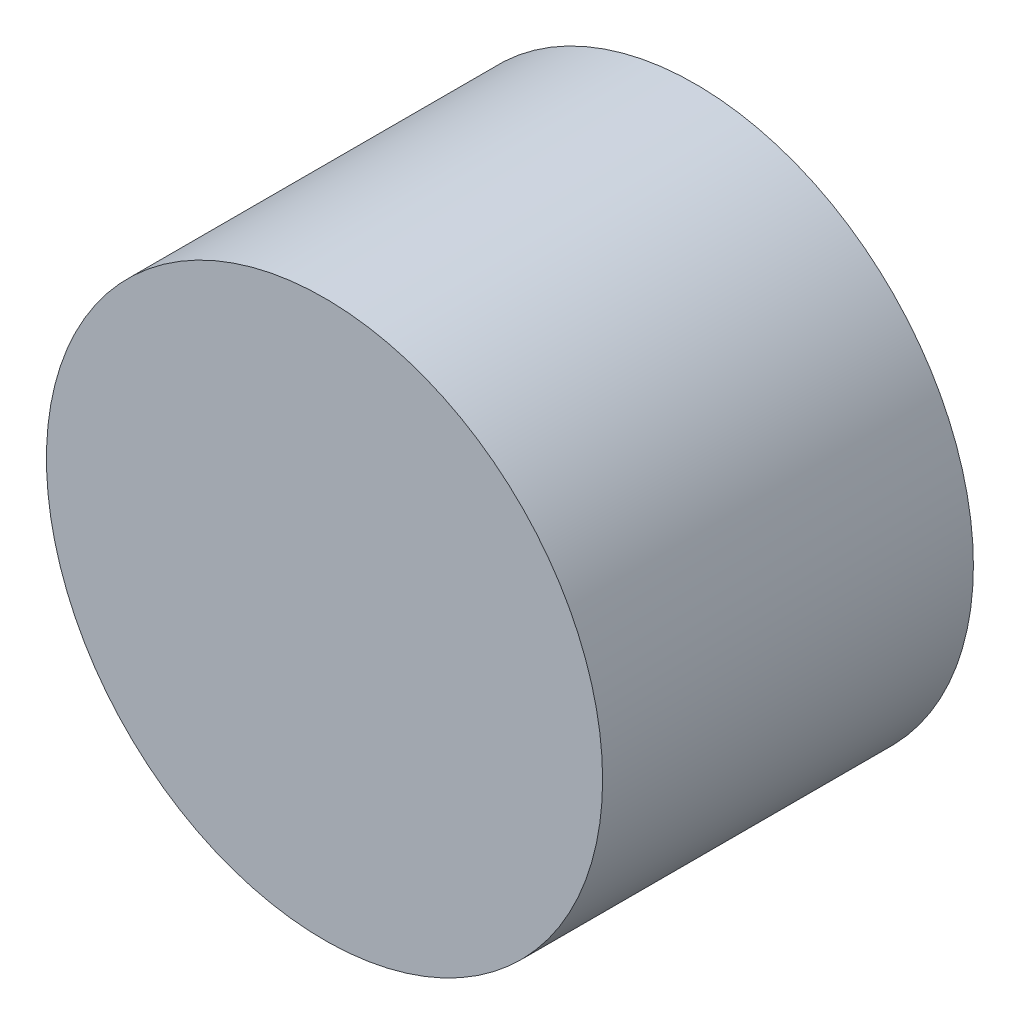
ISO-10303-21;
HEADER;
FILE_DESCRIPTION(('STEP AP214'),'2;1');
FILE_NAME('part.step','',(''),(''),'','','');
FILE_SCHEMA(('AUTOMOTIVE_DESIGN { 1 0 10303 214 1 1 1 1 }'));
ENDSEC;
DATA;
#1=APPLICATION_CONTEXT('core data for automotive mechanical design processes');
#2=APPLICATION_PROTOCOL_DEFINITION('international standard','automotive_design',2000,#1);
#3=PRODUCT_CONTEXT('',#1,'mechanical');
#4=PRODUCT('Part','Part','',(#3));
#5=PRODUCT_RELATED_PRODUCT_CATEGORY('part','',(#4));
#6=PRODUCT_DEFINITION_FORMATION('','',#4);
#7=PRODUCT_DEFINITION_CONTEXT('part definition',#1,'design');
#8=PRODUCT_DEFINITION('design','',#6,#7);
#9=PRODUCT_DEFINITION_SHAPE('','',#8);
#10=(LENGTH_UNIT() NAMED_UNIT(*) SI_UNIT(.MILLI.,.METRE.));
#11=(NAMED_UNIT(*) PLANE_ANGLE_UNIT() SI_UNIT($,.RADIAN.));
#12=(NAMED_UNIT(*) SI_UNIT($,.STERADIAN.) SOLID_ANGLE_UNIT());
#13=UNCERTAINTY_MEASURE_WITH_UNIT(LENGTH_MEASURE(1.E-05),#10,'distance_accuracy_value','');
#14=(GEOMETRIC_REPRESENTATION_CONTEXT(3) GLOBAL_UNCERTAINTY_ASSIGNED_CONTEXT((#13)) GLOBAL_UNIT_ASSIGNED_CONTEXT((#10,
#11,#12)) REPRESENTATION_CONTEXT('',''));
#15=CARTESIAN_POINT('',(0.,0.,0.));
#16=DIRECTION('',(0.,0.,1.));
#17=DIRECTION('',(1.,0.,0.));
#18=AXIS2_PLACEMENT_3D('',#15,#16,#17);
#19=CARTESIAN_POINT('',(0.,0.,40.));
#20=DIRECTION('',(0.,0.,-1.));
#21=DIRECTION('',(-1.,0.,0.));
#22=AXIS2_PLACEMENT_3D('',#19,#20,#21);
#23=CYLINDRICAL_SURFACE('',#22,30.);
#24=CARTESIAN_POINT('',(0.,0.,40.));
#25=DIRECTION('',(0.,0.,1.));
#26=DIRECTION('',(1.,0.,0.));
#27=AXIS2_PLACEMENT_3D('',#24,#25,#26);
#28=CIRCLE('',#27,30.);
#29=CARTESIAN_POINT('',(30.,0.,40.));
#30=VERTEX_POINT('',#29);
#31=EDGE_CURVE('E10',#30,#30,#28,.T.);
#32=ORIENTED_EDGE('',*,*,#31,.F.);
#33=EDGE_LOOP('',(#32));
#34=FACE_BOUND('',#33,.T.);
#35=CARTESIAN_POINT('',(0.,0.,0.));
#36=DIRECTION('',(0.,0.,1.));
#37=DIRECTION('',(1.,0.,0.));
#38=AXIS2_PLACEMENT_3D('',#35,#36,#37);
#39=CIRCLE('',#38,30.);
#40=CARTESIAN_POINT('',(30.,0.,0.));
#41=VERTEX_POINT('',#40);
#42=EDGE_CURVE('E46',#41,#41,#39,.T.);
#43=ORIENTED_EDGE('',*,*,#42,.T.);
#44=EDGE_LOOP('',(#43));
#45=FACE_BOUND('',#44,.T.);
#46=ADVANCED_FACE('F43',(#34,#45),#23,.T.);
#47=CARTESIAN_POINT('',(0.,0.,40.));
#48=DIRECTION('',(0.,0.,1.));
#49=DIRECTION('',(1.,0.,0.));
#50=AXIS2_PLACEMENT_3D('',#47,#48,#49);
#51=PLANE('',#50);
#52=ORIENTED_EDGE('',*,*,#31,.T.);
#53=EDGE_LOOP('',(#52));
#54=FACE_BOUND('',#53,.T.);
#55=ADVANCED_FACE('F60',(#54),#51,.T.);
#56=CARTESIAN_POINT('',(0.,0.,0.));
#57=DIRECTION('',(0.,0.,1.));
#58=DIRECTION('',(1.,0.,0.));
#59=AXIS2_PLACEMENT_3D('',#56,#57,#58);
#60=PLANE('',#59);
#61=ORIENTED_EDGE('',*,*,#42,.F.);
#62=EDGE_LOOP('',(#61));
#63=FACE_BOUND('',#62,.T.);
#64=ADVANCED_FACE('F58',(#63),#60,.F.);
#65=CLOSED_SHELL('',(#46,#55,#64));
#66=MANIFOLD_SOLID_BREP('B2',#65);
#67=ADVANCED_BREP_SHAPE_REPRESENTATION('',(#18,#66),#14);
#68=SHAPE_DEFINITION_REPRESENTATION(#9,#67);
ENDSEC;
END-ISO-10303-21;
